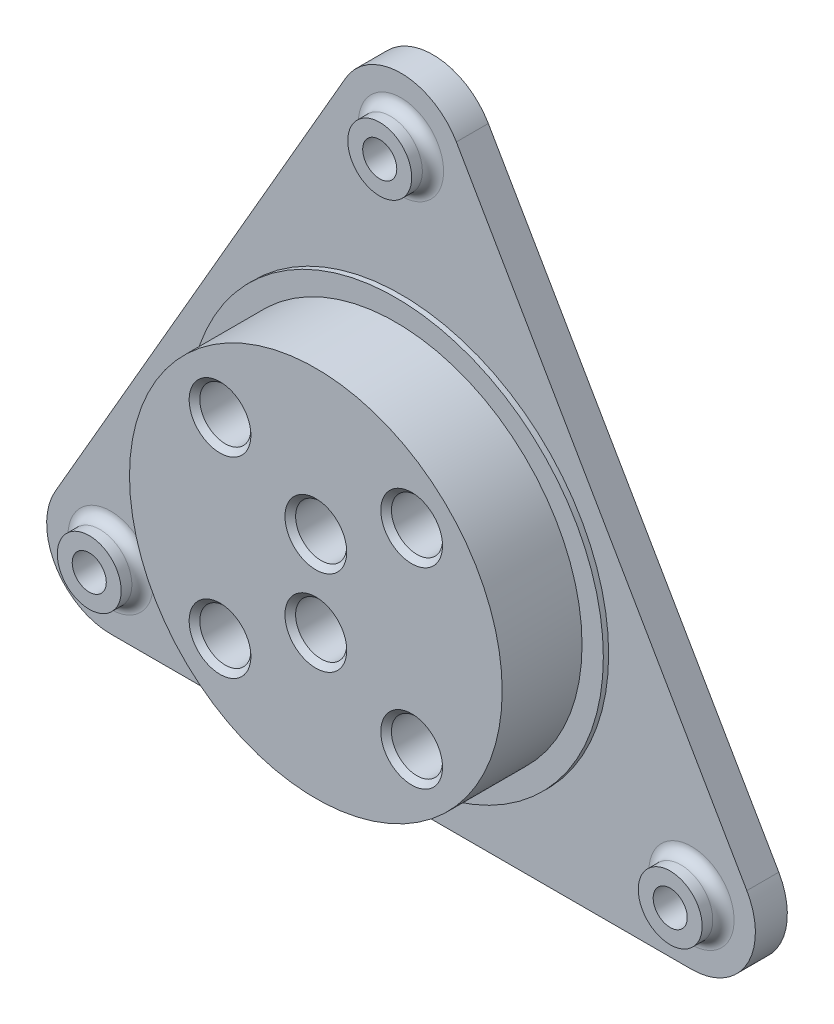
ISO-10303-21;
HEADER;
FILE_DESCRIPTION(('STEP AP214'),'2;1');
FILE_NAME('part.step','',(''),(''),'','','');
FILE_SCHEMA(('AUTOMOTIVE_DESIGN { 1 0 10303 214 1 1 1 1 }'));
ENDSEC;
DATA;
#1=APPLICATION_CONTEXT('core data for automotive mechanical design processes');
#2=APPLICATION_PROTOCOL_DEFINITION('international standard','automotive_design',2000,#1);
#3=PRODUCT_CONTEXT('',#1,'mechanical');
#4=PRODUCT('Part','Part','',(#3));
#5=PRODUCT_RELATED_PRODUCT_CATEGORY('part','',(#4));
#6=PRODUCT_DEFINITION_FORMATION('','',#4);
#7=PRODUCT_DEFINITION_CONTEXT('part definition',#1,'design');
#8=PRODUCT_DEFINITION('design','',#6,#7);
#9=PRODUCT_DEFINITION_SHAPE('','',#8);
#10=(LENGTH_UNIT() NAMED_UNIT(*) SI_UNIT(.MILLI.,.METRE.));
#11=(NAMED_UNIT(*) PLANE_ANGLE_UNIT() SI_UNIT($,.RADIAN.));
#12=(NAMED_UNIT(*) SI_UNIT($,.STERADIAN.) SOLID_ANGLE_UNIT());
#13=UNCERTAINTY_MEASURE_WITH_UNIT(LENGTH_MEASURE(1.E-05),#10,'distance_accuracy_value','');
#14=(GEOMETRIC_REPRESENTATION_CONTEXT(3) GLOBAL_UNCERTAINTY_ASSIGNED_CONTEXT((#13)) GLOBAL_UNIT_ASSIGNED_CONTEXT((#10,
#11,#12)) REPRESENTATION_CONTEXT('',''));
#15=CARTESIAN_POINT('',(0.,0.,0.));
#16=DIRECTION('',(0.,0.,1.));
#17=DIRECTION('',(1.,0.,0.));
#18=AXIS2_PLACEMENT_3D('',#15,#16,#17);
#19=CARTESIAN_POINT('',(0.,45.,3.));
#20=DIRECTION('',(0.,0.,-1.));
#21=DIRECTION('',(-1.,0.,0.));
#22=AXIS2_PLACEMENT_3D('',#19,#20,#21);
#23=PLANE('',#22);
#24=CARTESIAN_POINT('',(-27.2798002192098,-15.75,3.));
#25=DIRECTION('',(0.,0.,-1.));
#26=DIRECTION('',(-1.,0.,0.));
#27=AXIS2_PLACEMENT_3D('',#24,#25,#26);
#28=CIRCLE('',#27,4.);
#29=CARTESIAN_POINT('',(-31.2798002192098,-15.75,3.));
#30=VERTEX_POINT('',#29);
#31=EDGE_CURVE('E241',#30,#30,#28,.T.);
#32=ORIENTED_EDGE('',*,*,#31,.T.);
#33=EDGE_LOOP('',(#32));
#34=FACE_BOUND('',#33,.T.);
#35=CARTESIAN_POINT('',(27.2798002192098,-15.75,3.));
#36=DIRECTION('',(0.,0.,-1.));
#37=DIRECTION('',(-1.,0.,0.));
#38=AXIS2_PLACEMENT_3D('',#35,#36,#37);
#39=CIRCLE('',#38,4.00000000000001);
#40=CARTESIAN_POINT('',(23.2798002192098,-15.75,3.));
#41=VERTEX_POINT('',#40);
#42=EDGE_CURVE('E238',#41,#41,#39,.T.);
#43=ORIENTED_EDGE('',*,*,#42,.T.);
#44=EDGE_LOOP('',(#43));
#45=FACE_BOUND('',#44,.T.);
#46=CARTESIAN_POINT('',(0.,31.5,3.));
#47=DIRECTION('',(0.,0.,-1.));
#48=DIRECTION('',(-1.,0.,0.));
#49=AXIS2_PLACEMENT_3D('',#46,#47,#48);
#50=CIRCLE('',#49,4.);
#51=CARTESIAN_POINT('',(-4.,31.5,3.));
#52=VERTEX_POINT('',#51);
#53=EDGE_CURVE('E235',#52,#52,#50,.T.);
#54=ORIENTED_EDGE('',*,*,#53,.T.);
#55=EDGE_LOOP('',(#54));
#56=FACE_BOUND('',#55,.T.);
#57=CARTESIAN_POINT('',(0.,0.,3.));
#58=DIRECTION('',(0.,0.,1.));
#59=DIRECTION('',(1.,0.,0.));
#60=AXIS2_PLACEMENT_3D('',#57,#58,#59);
#61=CIRCLE('',#60,19.5);
#62=CARTESIAN_POINT('',(19.5,0.,3.));
#63=VERTEX_POINT('',#62);
#64=EDGE_CURVE('E190',#63,#63,#61,.T.);
#65=ORIENTED_EDGE('',*,*,#64,.F.);
#66=EDGE_LOOP('',(#65));
#67=FACE_BOUND('',#66,.T.);
#68=DIRECTION('',(0.5,-0.866025403784439,0.));
#69=VECTOR('',#68,1.);
#70=CARTESIAN_POINT('',(5.19615242270664,34.5,3.));
#71=LINE('',#70,#69);
#72=CARTESIAN_POINT('',(5.19615242270664,34.5,3.));
#73=VERTEX_POINT('',#72);
#74=CARTESIAN_POINT('',(32.4759526419165,-12.75,3.));
#75=VERTEX_POINT('',#74);
#76=EDGE_CURVE('E140',#73,#75,#71,.T.);
#77=ORIENTED_EDGE('',*,*,#76,.F.);
#78=CARTESIAN_POINT('',(0.,31.5,3.));
#79=DIRECTION('',(0.,0.,-1.));
#80=DIRECTION('',(-1.,0.,0.));
#81=AXIS2_PLACEMENT_3D('',#78,#79,#80);
#82=CIRCLE('',#81,6.00000000000001);
#83=CARTESIAN_POINT('',(-5.19615242270664,34.5,3.));
#84=VERTEX_POINT('',#83);
#85=EDGE_CURVE('E102',#84,#73,#82,.T.);
#86=ORIENTED_EDGE('',*,*,#85,.F.);
#87=DIRECTION('',(0.5,0.866025403784438,0.));
#88=VECTOR('',#87,1.);
#89=CARTESIAN_POINT('',(-5.19615242270664,34.5,3.));
#90=LINE('',#89,#88);
#91=CARTESIAN_POINT('',(-32.4759526419165,-12.75,3.));
#92=VERTEX_POINT('',#91);
#93=EDGE_CURVE('E123',#92,#84,#90,.T.);
#94=ORIENTED_EDGE('',*,*,#93,.F.);
#95=CARTESIAN_POINT('',(-27.2798002192098,-15.75,3.));
#96=DIRECTION('',(0.,0.,-1.));
#97=DIRECTION('',(-1.,0.,0.));
#98=AXIS2_PLACEMENT_3D('',#95,#96,#97);
#99=CIRCLE('',#98,6.00000000000001);
#100=CARTESIAN_POINT('',(-27.2798002192098,-21.75,3.));
#101=VERTEX_POINT('',#100);
#102=EDGE_CURVE('E62',#101,#92,#99,.T.);
#103=ORIENTED_EDGE('',*,*,#102,.F.);
#104=DIRECTION('',(-1.,0.,0.));
#105=VECTOR('',#104,1.);
#106=CARTESIAN_POINT('',(27.2798002192098,-21.75,3.));
#107=LINE('',#106,#105);
#108=CARTESIAN_POINT('',(27.2798002192098,-21.75,3.));
#109=VERTEX_POINT('',#108);
#110=EDGE_CURVE('E146',#109,#101,#107,.T.);
#111=ORIENTED_EDGE('',*,*,#110,.F.);
#112=CARTESIAN_POINT('',(27.2798002192098,-15.75,3.));
#113=DIRECTION('',(0.,0.,-1.));
#114=DIRECTION('',(-1.,0.,0.));
#115=AXIS2_PLACEMENT_3D('',#112,#113,#114);
#116=CIRCLE('',#115,6.);
#117=EDGE_CURVE('E143',#75,#109,#116,.T.);
#118=ORIENTED_EDGE('',*,*,#117,.F.);
#119=EDGE_LOOP('',(#77,#86,#94,#103,#111,#118));
#120=FACE_BOUND('',#119,.T.);
#121=ADVANCED_FACE('F45',(#34,#45,#56,#67,#120),#23,.F.);
#122=CARTESIAN_POINT('',(0.,17.5,3.5));
#123=DIRECTION('',(0.,0.,-1.));
#124=DIRECTION('',(-1.,0.,0.));
#125=AXIS2_PLACEMENT_3D('',#122,#123,#124);
#126=PLANE('',#125);
#127=CARTESIAN_POINT('',(0.,0.,3.5));
#128=DIRECTION('',(0.,0.,1.));
#129=DIRECTION('',(1.,0.,0.));
#130=AXIS2_PLACEMENT_3D('',#127,#128,#129);
#131=CIRCLE('',#130,17.5);
#132=CARTESIAN_POINT('',(17.5,0.,3.5));
#133=VERTEX_POINT('',#132);
#134=EDGE_CURVE('E179',#133,#133,#131,.T.);
#135=ORIENTED_EDGE('',*,*,#134,.F.);
#136=EDGE_LOOP('',(#135));
#137=FACE_BOUND('',#136,.T.);
#138=CARTESIAN_POINT('',(0.,0.,3.5));
#139=DIRECTION('',(0.,0.,1.));
#140=DIRECTION('',(1.,0.,0.));
#141=AXIS2_PLACEMENT_3D('',#138,#139,#140);
#142=CIRCLE('',#141,19.5);
#143=CARTESIAN_POINT('',(19.5,0.,3.5));
#144=VERTEX_POINT('',#143);
#145=EDGE_CURVE('E193',#144,#144,#142,.T.);
#146=ORIENTED_EDGE('',*,*,#145,.T.);
#147=EDGE_LOOP('',(#146));
#148=FACE_BOUND('',#147,.T.);
#149=ADVANCED_FACE('F316',(#137,#148),#126,.F.);
#150=CARTESIAN_POINT('',(0.,0.,11.));
#151=DIRECTION('',(0.,0.,1.));
#152=DIRECTION('',(1.,0.,0.));
#153=AXIS2_PLACEMENT_3D('',#150,#151,#152);
#154=CYLINDRICAL_SURFACE('',#153,19.5);
#155=ORIENTED_EDGE('',*,*,#145,.F.);
#156=EDGE_LOOP('',(#155));
#157=FACE_BOUND('',#156,.T.);
#158=ORIENTED_EDGE('',*,*,#64,.T.);
#159=EDGE_LOOP('',(#158));
#160=FACE_BOUND('',#159,.T.);
#161=ADVANCED_FACE('F324',(#157,#160),#154,.T.);
#162=CARTESIAN_POINT('',(0.,0.,0.));
#163=DIRECTION('',(0.,0.,1.));
#164=DIRECTION('',(1.,0.,0.));
#165=AXIS2_PLACEMENT_3D('',#162,#163,#164);
#166=PLANE('',#165);
#167=DIRECTION('',(0.5,0.866025403784438,0.));
#168=VECTOR('',#167,1.);
#169=CARTESIAN_POINT('',(-5.19615242270664,34.5,0.));
#170=LINE('',#169,#168);
#171=CARTESIAN_POINT('',(-32.4759526419165,-12.75,0.));
#172=VERTEX_POINT('',#171);
#173=CARTESIAN_POINT('',(-5.19615242270664,34.5,0.));
#174=VERTEX_POINT('',#173);
#175=EDGE_CURVE('E122',#172,#174,#170,.T.);
#176=ORIENTED_EDGE('',*,*,#175,.T.);
#177=CARTESIAN_POINT('',(0.,31.5,0.));
#178=DIRECTION('',(0.,0.,-1.));
#179=DIRECTION('',(-1.,0.,0.));
#180=AXIS2_PLACEMENT_3D('',#177,#178,#179);
#181=CIRCLE('',#180,6.00000000000001);
#182=CARTESIAN_POINT('',(5.19615242270664,34.5,0.));
#183=VERTEX_POINT('',#182);
#184=EDGE_CURVE('E70',#174,#183,#181,.T.);
#185=ORIENTED_EDGE('',*,*,#184,.T.);
#186=DIRECTION('',(0.5,-0.866025403784439,0.));
#187=VECTOR('',#186,1.);
#188=CARTESIAN_POINT('',(5.19615242270664,34.5,0.));
#189=LINE('',#188,#187);
#190=CARTESIAN_POINT('',(32.4759526419165,-12.75,0.));
#191=VERTEX_POINT('',#190);
#192=EDGE_CURVE('E110',#183,#191,#189,.T.);
#193=ORIENTED_EDGE('',*,*,#192,.T.);
#194=CARTESIAN_POINT('',(27.2798002192098,-15.75,0.));
#195=DIRECTION('',(0.,0.,-1.));
#196=DIRECTION('',(-1.,0.,0.));
#197=AXIS2_PLACEMENT_3D('',#194,#195,#196);
#198=CIRCLE('',#197,6.);
#199=CARTESIAN_POINT('',(27.2798002192098,-21.75,0.));
#200=VERTEX_POINT('',#199);
#201=EDGE_CURVE('E115',#191,#200,#198,.T.);
#202=ORIENTED_EDGE('',*,*,#201,.T.);
#203=DIRECTION('',(-1.,0.,0.));
#204=VECTOR('',#203,1.);
#205=CARTESIAN_POINT('',(27.2798002192098,-21.75,0.));
#206=LINE('',#205,#204);
#207=CARTESIAN_POINT('',(-27.2798002192098,-21.75,0.));
#208=VERTEX_POINT('',#207);
#209=EDGE_CURVE('E132',#200,#208,#206,.T.);
#210=ORIENTED_EDGE('',*,*,#209,.T.);
#211=CARTESIAN_POINT('',(-27.2798002192098,-15.75,0.));
#212=DIRECTION('',(0.,0.,-1.));
#213=DIRECTION('',(-1.,0.,0.));
#214=AXIS2_PLACEMENT_3D('',#211,#212,#213);
#215=CIRCLE('',#214,6.00000000000001);
#216=EDGE_CURVE('E135',#208,#172,#215,.T.);
#217=ORIENTED_EDGE('',*,*,#216,.T.);
#218=EDGE_LOOP('',(#176,#185,#193,#202,#210,#217));
#219=FACE_BOUND('',#218,.T.);
#220=CARTESIAN_POINT('',(0.,31.5,0.));
#221=DIRECTION('',(0.,0.,-1.));
#222=DIRECTION('',(0.,1.,0.));
#223=AXIS2_PLACEMENT_3D('',#220,#221,#222);
#224=CIRCLE('',#223,1.6);
#225=CARTESIAN_POINT('',(0.,33.1,0.));
#226=VERTEX_POINT('',#225);
#227=EDGE_CURVE('E176',#226,#226,#224,.T.);
#228=ORIENTED_EDGE('',*,*,#227,.F.);
#229=EDGE_LOOP('',(#228));
#230=FACE_BOUND('',#229,.T.);
#231=CARTESIAN_POINT('',(-27.2798002192098,-15.75,0.));
#232=DIRECTION('',(0.,0.,-1.));
#233=DIRECTION('',(0.,1.,0.));
#234=AXIS2_PLACEMENT_3D('',#231,#232,#233);
#235=CIRCLE('',#234,1.6);
#236=CARTESIAN_POINT('',(-27.2798002192098,-14.15,0.));
#237=VERTEX_POINT('',#236);
#238=EDGE_CURVE('E180',#237,#237,#235,.T.);
#239=ORIENTED_EDGE('',*,*,#238,.F.);
#240=EDGE_LOOP('',(#239));
#241=FACE_BOUND('',#240,.T.);
#242=CARTESIAN_POINT('',(27.2798002192098,-15.75,0.));
#243=DIRECTION('',(0.,0.,-1.));
#244=DIRECTION('',(0.,1.,0.));
#245=AXIS2_PLACEMENT_3D('',#242,#243,#244);
#246=CIRCLE('',#245,1.6);
#247=CARTESIAN_POINT('',(27.2798002192098,-14.15,0.));
#248=VERTEX_POINT('',#247);
#249=EDGE_CURVE('E175',#248,#248,#246,.T.);
#250=ORIENTED_EDGE('',*,*,#249,.F.);
#251=EDGE_LOOP('',(#250));
#252=FACE_BOUND('',#251,.T.);
#253=ADVANCED_FACE('F118',(#219,#230,#241,#252),#166,.F.);
#254=CARTESIAN_POINT('',(0.,17.5,11.));
#255=DIRECTION('',(0.,0.,-1.));
#256=DIRECTION('',(-1.,0.,0.));
#257=AXIS2_PLACEMENT_3D('',#254,#255,#256);
#258=PLANE('',#257);
#259=CARTESIAN_POINT('',(-9.,-9.,11.));
#260=DIRECTION('',(0.,0.,-1.));
#261=DIRECTION('',(-1.,0.,0.));
#262=AXIS2_PLACEMENT_3D('',#259,#260,#261);
#263=CIRCLE('',#262,2.9);
#264=CARTESIAN_POINT('',(-11.9,-9.,11.));
#265=VERTEX_POINT('',#264);
#266=EDGE_CURVE('E214',#265,#265,#263,.T.);
#267=ORIENTED_EDGE('',*,*,#266,.T.);
#268=EDGE_LOOP('',(#267));
#269=FACE_BOUND('',#268,.T.);
#270=CARTESIAN_POINT('',(9.,-9.,11.));
#271=DIRECTION('',(0.,0.,-1.));
#272=DIRECTION('',(-1.,0.,0.));
#273=AXIS2_PLACEMENT_3D('',#270,#271,#272);
#274=CIRCLE('',#273,2.9);
#275=CARTESIAN_POINT('',(6.1,-9.,11.));
#276=VERTEX_POINT('',#275);
#277=EDGE_CURVE('E211',#276,#276,#274,.T.);
#278=ORIENTED_EDGE('',*,*,#277,.T.);
#279=EDGE_LOOP('',(#278));
#280=FACE_BOUND('',#279,.T.);
#281=CARTESIAN_POINT('',(9.,9.,11.));
#282=DIRECTION('',(0.,0.,-1.));
#283=DIRECTION('',(-1.,0.,0.));
#284=AXIS2_PLACEMENT_3D('',#281,#282,#283);
#285=CIRCLE('',#284,2.9);
#286=CARTESIAN_POINT('',(6.1,9.,11.));
#287=VERTEX_POINT('',#286);
#288=EDGE_CURVE('E208',#287,#287,#285,.T.);
#289=ORIENTED_EDGE('',*,*,#288,.T.);
#290=EDGE_LOOP('',(#289));
#291=FACE_BOUND('',#290,.T.);
#292=CARTESIAN_POINT('',(-9.,9.,11.));
#293=DIRECTION('',(0.,0.,-1.));
#294=DIRECTION('',(-1.,0.,0.));
#295=AXIS2_PLACEMENT_3D('',#292,#293,#294);
#296=CIRCLE('',#295,2.9);
#297=CARTESIAN_POINT('',(-11.9,9.,11.));
#298=VERTEX_POINT('',#297);
#299=EDGE_CURVE('E205',#298,#298,#296,.T.);
#300=ORIENTED_EDGE('',*,*,#299,.T.);
#301=EDGE_LOOP('',(#300));
#302=FACE_BOUND('',#301,.T.);
#303=CARTESIAN_POINT('',(0.,-4.,11.));
#304=DIRECTION('',(0.,0.,-1.));
#305=DIRECTION('',(-1.,0.,0.));
#306=AXIS2_PLACEMENT_3D('',#303,#304,#305);
#307=CIRCLE('',#306,2.9);
#308=CARTESIAN_POINT('',(-2.9,-4.,11.));
#309=VERTEX_POINT('',#308);
#310=EDGE_CURVE('E202',#309,#309,#307,.T.);
#311=ORIENTED_EDGE('',*,*,#310,.T.);
#312=EDGE_LOOP('',(#311));
#313=FACE_BOUND('',#312,.T.);
#314=CARTESIAN_POINT('',(0.,4.,11.));
#315=DIRECTION('',(0.,0.,-1.));
#316=DIRECTION('',(-1.,0.,0.));
#317=AXIS2_PLACEMENT_3D('',#314,#315,#316);
#318=CIRCLE('',#317,2.9);
#319=CARTESIAN_POINT('',(-2.9,4.,11.));
#320=VERTEX_POINT('',#319);
#321=EDGE_CURVE('E199',#320,#320,#318,.T.);
#322=ORIENTED_EDGE('',*,*,#321,.T.);
#323=EDGE_LOOP('',(#322));
#324=FACE_BOUND('',#323,.T.);
#325=CARTESIAN_POINT('',(0.,0.,11.));
#326=DIRECTION('',(0.,0.,1.));
#327=DIRECTION('',(1.,0.,0.));
#328=AXIS2_PLACEMENT_3D('',#325,#326,#327);
#329=CIRCLE('',#328,17.5);
#330=CARTESIAN_POINT('',(17.5,0.,11.));
#331=VERTEX_POINT('',#330);
#332=EDGE_CURVE('E187',#331,#331,#329,.T.);
#333=ORIENTED_EDGE('',*,*,#332,.T.);
#334=EDGE_LOOP('',(#333));
#335=FACE_BOUND('',#334,.T.);
#336=ADVANCED_FACE('F482',(#269,#280,#291,#302,#313,#324,#335),#258,.F.);
#337=CARTESIAN_POINT('',(0.,0.,11.));
#338=DIRECTION('',(0.,0.,1.));
#339=DIRECTION('',(1.,0.,0.));
#340=AXIS2_PLACEMENT_3D('',#337,#338,#339);
#341=CYLINDRICAL_SURFACE('',#340,17.5);
#342=ORIENTED_EDGE('',*,*,#332,.F.);
#343=EDGE_LOOP('',(#342));
#344=FACE_BOUND('',#343,.T.);
#345=ORIENTED_EDGE('',*,*,#134,.T.);
#346=EDGE_LOOP('',(#345));
#347=FACE_BOUND('',#346,.T.);
#348=ADVANCED_FACE('F479',(#344,#347),#341,.T.);
#349=CARTESIAN_POINT('',(27.2798002192098,-15.75,11.));
#350=DIRECTION('',(0.,0.,-1.));
#351=DIRECTION('',(0.,1.,0.));
#352=AXIS2_PLACEMENT_3D('',#349,#350,#351);
#353=CYLINDRICAL_SURFACE('',#352,1.6);
#354=ORIENTED_EDGE('',*,*,#249,.T.);
#355=EDGE_LOOP('',(#354));
#356=FACE_BOUND('',#355,.T.);
#357=CARTESIAN_POINT('',(27.2798002192098,-15.75,5.));
#358=DIRECTION('',(0.,0.,1.));
#359=DIRECTION('',(1.,0.,0.));
#360=AXIS2_PLACEMENT_3D('',#357,#358,#359);
#361=CIRCLE('',#360,1.6);
#362=CARTESIAN_POINT('',(28.8798002192098,-15.75,5.));
#363=VERTEX_POINT('',#362);
#364=EDGE_CURVE('E128',#363,#363,#361,.T.);
#365=ORIENTED_EDGE('',*,*,#364,.T.);
#366=EDGE_LOOP('',(#365));
#367=FACE_BOUND('',#366,.T.);
#368=ADVANCED_FACE('F475',(#356,#367),#353,.F.);
#369=CARTESIAN_POINT('',(-27.2798002192098,-15.75,11.));
#370=DIRECTION('',(0.,0.,-1.));
#371=DIRECTION('',(0.,1.,0.));
#372=AXIS2_PLACEMENT_3D('',#369,#370,#371);
#373=CYLINDRICAL_SURFACE('',#372,1.6);
#374=ORIENTED_EDGE('',*,*,#238,.T.);
#375=EDGE_LOOP('',(#374));
#376=FACE_BOUND('',#375,.T.);
#377=CARTESIAN_POINT('',(-27.2798002192098,-15.75,5.));
#378=DIRECTION('',(0.,0.,1.));
#379=DIRECTION('',(1.,0.,0.));
#380=AXIS2_PLACEMENT_3D('',#377,#378,#379);
#381=CIRCLE('',#380,1.6);
#382=CARTESIAN_POINT('',(-25.6798002192098,-15.75,5.));
#383=VERTEX_POINT('',#382);
#384=EDGE_CURVE('E272',#383,#383,#381,.T.);
#385=ORIENTED_EDGE('',*,*,#384,.T.);
#386=EDGE_LOOP('',(#385));
#387=FACE_BOUND('',#386,.T.);
#388=ADVANCED_FACE('F471',(#376,#387),#373,.F.);
#389=CARTESIAN_POINT('',(0.,31.5,11.));
#390=DIRECTION('',(0.,0.,-1.));
#391=DIRECTION('',(0.,1.,0.));
#392=AXIS2_PLACEMENT_3D('',#389,#390,#391);
#393=CYLINDRICAL_SURFACE('',#392,1.6);
#394=ORIENTED_EDGE('',*,*,#227,.T.);
#395=EDGE_LOOP('',(#394));
#396=FACE_BOUND('',#395,.T.);
#397=CARTESIAN_POINT('',(0.,31.5,5.));
#398=DIRECTION('',(0.,0.,1.));
#399=DIRECTION('',(1.,0.,0.));
#400=AXIS2_PLACEMENT_3D('',#397,#398,#399);
#401=CIRCLE('',#400,1.6);
#402=CARTESIAN_POINT('',(1.6,31.5,5.));
#403=VERTEX_POINT('',#402);
#404=EDGE_CURVE('E275',#403,#403,#401,.T.);
#405=ORIENTED_EDGE('',*,*,#404,.T.);
#406=EDGE_LOOP('',(#405));
#407=FACE_BOUND('',#406,.T.);
#408=ADVANCED_FACE('F467',(#396,#407),#393,.F.);
#409=CARTESIAN_POINT('',(0.,4.,7.));
#410=DIRECTION('',(0.,0.,1.));
#411=DIRECTION('',(1.,0.,0.));
#412=AXIS2_PLACEMENT_3D('',#409,#410,#411);
#413=CYLINDRICAL_SURFACE('',#412,2.4);
#414=CARTESIAN_POINT('',(0.,4.,10.5));
#415=DIRECTION('',(0.,0.,-1.));
#416=DIRECTION('',(-1.,0.,0.));
#417=AXIS2_PLACEMENT_3D('',#414,#415,#416);
#418=CIRCLE('',#417,2.4);
#419=CARTESIAN_POINT('',(-2.4,4.,10.5));
#420=VERTEX_POINT('',#419);
#421=EDGE_CURVE('E229',#420,#420,#418,.F.);
#422=ORIENTED_EDGE('',*,*,#421,.T.);
#423=EDGE_LOOP('',(#422));
#424=FACE_BOUND('',#423,.T.);
#425=CARTESIAN_POINT('',(0.,4.,7.));
#426=DIRECTION('',(0.,0.,1.));
#427=DIRECTION('',(1.,0.,0.));
#428=AXIS2_PLACEMENT_3D('',#425,#426,#427);
#429=CIRCLE('',#428,2.4);
#430=CARTESIAN_POINT('',(2.4,4.,7.));
#431=VERTEX_POINT('',#430);
#432=EDGE_CURVE('E164',#431,#431,#429,.T.);
#433=ORIENTED_EDGE('',*,*,#432,.F.);
#434=EDGE_LOOP('',(#433));
#435=FACE_BOUND('',#434,.T.);
#436=ADVANCED_FACE('F463',(#424,#435),#413,.F.);
#437=CARTESIAN_POINT('',(0.,4.,7.));
#438=DIRECTION('',(0.,0.,1.));
#439=DIRECTION('',(1.,0.,0.));
#440=AXIS2_PLACEMENT_3D('',#437,#438,#439);
#441=PLANE('',#440);
#442=CARTESIAN_POINT('',(0.,4.,7.));
#443=DIRECTION('',(0.,0.,1.));
#444=DIRECTION('',(1.,0.,0.));
#445=AXIS2_PLACEMENT_3D('',#442,#443,#444);
#446=CIRCLE('',#445,1.75);
#447=CARTESIAN_POINT('',(1.75,4.,7.));
#448=VERTEX_POINT('',#447);
#449=EDGE_CURVE('E49',#448,#448,#446,.T.);
#450=ORIENTED_EDGE('',*,*,#449,.F.);
#451=EDGE_LOOP('',(#450));
#452=FACE_BOUND('',#451,.T.);
#453=ORIENTED_EDGE('',*,*,#432,.T.);
#454=EDGE_LOOP('',(#453));
#455=FACE_BOUND('',#454,.T.);
#456=ADVANCED_FACE('F426',(#452,#455),#441,.T.);
#457=CARTESIAN_POINT('',(-9.,-9.,7.));
#458=DIRECTION('',(0.,0.,1.));
#459=DIRECTION('',(1.,0.,0.));
#460=AXIS2_PLACEMENT_3D('',#457,#458,#459);
#461=CYLINDRICAL_SURFACE('',#460,2.4);
#462=CARTESIAN_POINT('',(-9.,-9.,10.5));
#463=DIRECTION('',(0.,0.,-1.));
#464=DIRECTION('',(-1.,0.,0.));
#465=AXIS2_PLACEMENT_3D('',#462,#463,#464);
#466=CIRCLE('',#465,2.4);
#467=CARTESIAN_POINT('',(-11.4,-9.,10.5));
#468=VERTEX_POINT('',#467);
#469=EDGE_CURVE('E196',#468,#468,#466,.F.);
#470=ORIENTED_EDGE('',*,*,#469,.T.);
#471=EDGE_LOOP('',(#470));
#472=FACE_BOUND('',#471,.T.);
#473=CARTESIAN_POINT('',(-9.,-9.,7.));
#474=DIRECTION('',(0.,0.,1.));
#475=DIRECTION('',(1.,0.,0.));
#476=AXIS2_PLACEMENT_3D('',#473,#474,#475);
#477=CIRCLE('',#476,2.4);
#478=CARTESIAN_POINT('',(-6.6,-9.,7.));
#479=VERTEX_POINT('',#478);
#480=EDGE_CURVE('E106',#479,#479,#477,.T.);
#481=ORIENTED_EDGE('',*,*,#480,.F.);
#482=EDGE_LOOP('',(#481));
#483=FACE_BOUND('',#482,.T.);
#484=ADVANCED_FACE('F422',(#472,#483),#461,.F.);
#485=CARTESIAN_POINT('',(-9.,-9.,7.));
#486=DIRECTION('',(0.,0.,1.));
#487=DIRECTION('',(1.,0.,0.));
#488=AXIS2_PLACEMENT_3D('',#485,#486,#487);
#489=PLANE('',#488);
#490=CARTESIAN_POINT('',(-9.,-9.,7.));
#491=DIRECTION('',(0.,0.,1.));
#492=DIRECTION('',(1.,0.,0.));
#493=AXIS2_PLACEMENT_3D('',#490,#491,#492);
#494=CIRCLE('',#493,1.75);
#495=CARTESIAN_POINT('',(-7.25,-9.,7.));
#496=VERTEX_POINT('',#495);
#497=EDGE_CURVE('E258',#496,#496,#494,.T.);
#498=ORIENTED_EDGE('',*,*,#497,.F.);
#499=EDGE_LOOP('',(#498));
#500=FACE_BOUND('',#499,.T.);
#501=ORIENTED_EDGE('',*,*,#480,.T.);
#502=EDGE_LOOP('',(#501));
#503=FACE_BOUND('',#502,.T.);
#504=ADVANCED_FACE('F425',(#500,#503),#489,.T.);
#505=CARTESIAN_POINT('',(9.,-9.,7.));
#506=DIRECTION('',(0.,0.,1.));
#507=DIRECTION('',(1.,0.,0.));
#508=AXIS2_PLACEMENT_3D('',#505,#506,#507);
#509=CYLINDRICAL_SURFACE('',#508,2.4);
#510=CARTESIAN_POINT('',(9.,-9.,10.5));
#511=DIRECTION('',(0.,0.,-1.));
#512=DIRECTION('',(-1.,0.,0.));
#513=AXIS2_PLACEMENT_3D('',#510,#511,#512);
#514=CIRCLE('',#513,2.4);
#515=CARTESIAN_POINT('',(6.6,-9.,10.5));
#516=VERTEX_POINT('',#515);
#517=EDGE_CURVE('E217',#516,#516,#514,.F.);
#518=ORIENTED_EDGE('',*,*,#517,.T.);
#519=EDGE_LOOP('',(#518));
#520=FACE_BOUND('',#519,.T.);
#521=CARTESIAN_POINT('',(9.,-9.,7.));
#522=DIRECTION('',(0.,0.,1.));
#523=DIRECTION('',(1.,0.,0.));
#524=AXIS2_PLACEMENT_3D('',#521,#522,#523);
#525=CIRCLE('',#524,2.4);
#526=CARTESIAN_POINT('',(11.4,-9.,7.));
#527=VERTEX_POINT('',#526);
#528=EDGE_CURVE('E160',#527,#527,#525,.T.);
#529=ORIENTED_EDGE('',*,*,#528,.F.);
#530=EDGE_LOOP('',(#529));
#531=FACE_BOUND('',#530,.T.);
#532=ADVANCED_FACE('F430',(#520,#531),#509,.F.);
#533=CARTESIAN_POINT('',(9.,-9.,7.));
#534=DIRECTION('',(0.,0.,1.));
#535=DIRECTION('',(1.,0.,0.));
#536=AXIS2_PLACEMENT_3D('',#533,#534,#535);
#537=PLANE('',#536);
#538=CARTESIAN_POINT('',(9.,-9.,7.));
#539=DIRECTION('',(0.,0.,1.));
#540=DIRECTION('',(1.,0.,0.));
#541=AXIS2_PLACEMENT_3D('',#538,#539,#540);
#542=CIRCLE('',#541,1.75);
#543=CARTESIAN_POINT('',(10.75,-9.,7.));
#544=VERTEX_POINT('',#543);
#545=EDGE_CURVE('E256',#544,#544,#542,.T.);
#546=ORIENTED_EDGE('',*,*,#545,.F.);
#547=EDGE_LOOP('',(#546));
#548=FACE_BOUND('',#547,.T.);
#549=ORIENTED_EDGE('',*,*,#528,.T.);
#550=EDGE_LOOP('',(#549));
#551=FACE_BOUND('',#550,.T.);
#552=ADVANCED_FACE('F450',(#548,#551),#537,.T.);
#553=CARTESIAN_POINT('',(9.,9.,7.));
#554=DIRECTION('',(0.,0.,1.));
#555=DIRECTION('',(1.,0.,0.));
#556=AXIS2_PLACEMENT_3D('',#553,#554,#555);
#557=CYLINDRICAL_SURFACE('',#556,2.4);
#558=CARTESIAN_POINT('',(9.,9.,10.5));
#559=DIRECTION('',(0.,0.,-1.));
#560=DIRECTION('',(-1.,0.,0.));
#561=AXIS2_PLACEMENT_3D('',#558,#559,#560);
#562=CIRCLE('',#561,2.4);
#563=CARTESIAN_POINT('',(6.6,9.,10.5));
#564=VERTEX_POINT('',#563);
#565=EDGE_CURVE('E220',#564,#564,#562,.F.);
#566=ORIENTED_EDGE('',*,*,#565,.T.);
#567=EDGE_LOOP('',(#566));
#568=FACE_BOUND('',#567,.T.);
#569=CARTESIAN_POINT('',(9.,9.,7.));
#570=DIRECTION('',(0.,0.,1.));
#571=DIRECTION('',(1.,0.,0.));
#572=AXIS2_PLACEMENT_3D('',#569,#570,#571);
#573=CIRCLE('',#572,2.4);
#574=CARTESIAN_POINT('',(11.4,9.,7.));
#575=VERTEX_POINT('',#574);
#576=EDGE_CURVE('E168',#575,#575,#573,.T.);
#577=ORIENTED_EDGE('',*,*,#576,.F.);
#578=EDGE_LOOP('',(#577));
#579=FACE_BOUND('',#578,.T.);
#580=ADVANCED_FACE('F447',(#568,#579),#557,.F.);
#581=CARTESIAN_POINT('',(9.,9.,7.));
#582=DIRECTION('',(0.,0.,1.));
#583=DIRECTION('',(1.,0.,0.));
#584=AXIS2_PLACEMENT_3D('',#581,#582,#583);
#585=PLANE('',#584);
#586=CARTESIAN_POINT('',(9.,9.,7.));
#587=DIRECTION('',(0.,0.,1.));
#588=DIRECTION('',(1.,0.,0.));
#589=AXIS2_PLACEMENT_3D('',#586,#587,#588);
#590=CIRCLE('',#589,1.75);
#591=CARTESIAN_POINT('',(10.75,9.,7.));
#592=VERTEX_POINT('',#591);
#593=EDGE_CURVE('E253',#592,#592,#590,.T.);
#594=ORIENTED_EDGE('',*,*,#593,.F.);
#595=EDGE_LOOP('',(#594));
#596=FACE_BOUND('',#595,.T.);
#597=ORIENTED_EDGE('',*,*,#576,.T.);
#598=EDGE_LOOP('',(#597));
#599=FACE_BOUND('',#598,.T.);
#600=ADVANCED_FACE('F442',(#596,#599),#585,.T.);
#601=CARTESIAN_POINT('',(-9.,9.,7.));
#602=DIRECTION('',(0.,0.,1.));
#603=DIRECTION('',(1.,0.,0.));
#604=AXIS2_PLACEMENT_3D('',#601,#602,#603);
#605=CYLINDRICAL_SURFACE('',#604,2.4);
#606=CARTESIAN_POINT('',(-9.,9.,10.5));
#607=DIRECTION('',(0.,0.,-1.));
#608=DIRECTION('',(-1.,0.,0.));
#609=AXIS2_PLACEMENT_3D('',#606,#607,#608);
#610=CIRCLE('',#609,2.4);
#611=CARTESIAN_POINT('',(-11.4,9.,10.5));
#612=VERTEX_POINT('',#611);
#613=EDGE_CURVE('E223',#612,#612,#610,.F.);
#614=ORIENTED_EDGE('',*,*,#613,.T.);
#615=EDGE_LOOP('',(#614));
#616=FACE_BOUND('',#615,.T.);
#617=CARTESIAN_POINT('',(-9.,9.,7.));
#618=DIRECTION('',(0.,0.,1.));
#619=DIRECTION('',(1.,0.,0.));
#620=AXIS2_PLACEMENT_3D('',#617,#618,#619);
#621=CIRCLE('',#620,2.4);
#622=CARTESIAN_POINT('',(-6.6,9.,7.));
#623=VERTEX_POINT('',#622);
#624=EDGE_CURVE('E165',#623,#623,#621,.T.);
#625=ORIENTED_EDGE('',*,*,#624,.F.);
#626=EDGE_LOOP('',(#625));
#627=FACE_BOUND('',#626,.T.);
#628=ADVANCED_FACE('F439',(#616,#627),#605,.F.);
#629=CARTESIAN_POINT('',(-9.,9.,7.));
#630=DIRECTION('',(0.,0.,1.));
#631=DIRECTION('',(1.,0.,0.));
#632=AXIS2_PLACEMENT_3D('',#629,#630,#631);
#633=PLANE('',#632);
#634=CARTESIAN_POINT('',(-9.,9.,7.));
#635=DIRECTION('',(0.,0.,1.));
#636=DIRECTION('',(1.,0.,0.));
#637=AXIS2_PLACEMENT_3D('',#634,#635,#636);
#638=CIRCLE('',#637,1.75);
#639=CARTESIAN_POINT('',(-7.25,9.,7.));
#640=VERTEX_POINT('',#639);
#641=EDGE_CURVE('E249',#640,#640,#638,.T.);
#642=ORIENTED_EDGE('',*,*,#641,.F.);
#643=EDGE_LOOP('',(#642));
#644=FACE_BOUND('',#643,.T.);
#645=ORIENTED_EDGE('',*,*,#624,.T.);
#646=EDGE_LOOP('',(#645));
#647=FACE_BOUND('',#646,.T.);
#648=ADVANCED_FACE('F435',(#644,#647),#633,.T.);
#649=CARTESIAN_POINT('',(0.,-4.,7.));
#650=DIRECTION('',(0.,0.,1.));
#651=DIRECTION('',(1.,0.,0.));
#652=AXIS2_PLACEMENT_3D('',#649,#650,#651);
#653=CYLINDRICAL_SURFACE('',#652,2.4);
#654=CARTESIAN_POINT('',(0.,-4.,10.5));
#655=DIRECTION('',(0.,0.,-1.));
#656=DIRECTION('',(-1.,0.,0.));
#657=AXIS2_PLACEMENT_3D('',#654,#655,#656);
#658=CIRCLE('',#657,2.4);
#659=CARTESIAN_POINT('',(-2.4,-4.,10.5));
#660=VERTEX_POINT('',#659);
#661=EDGE_CURVE('E226',#660,#660,#658,.F.);
#662=ORIENTED_EDGE('',*,*,#661,.T.);
#663=EDGE_LOOP('',(#662));
#664=FACE_BOUND('',#663,.T.);
#665=CARTESIAN_POINT('',(0.,-4.,7.));
#666=DIRECTION('',(0.,0.,1.));
#667=DIRECTION('',(1.,0.,0.));
#668=AXIS2_PLACEMENT_3D('',#665,#666,#667);
#669=CIRCLE('',#668,2.4);
#670=CARTESIAN_POINT('',(2.4,-4.,7.));
#671=VERTEX_POINT('',#670);
#672=EDGE_CURVE('E161',#671,#671,#669,.T.);
#673=ORIENTED_EDGE('',*,*,#672,.F.);
#674=EDGE_LOOP('',(#673));
#675=FACE_BOUND('',#674,.T.);
#676=ADVANCED_FACE('F432',(#664,#675),#653,.F.);
#677=CARTESIAN_POINT('',(0.,-4.,7.));
#678=DIRECTION('',(0.,0.,1.));
#679=DIRECTION('',(1.,0.,0.));
#680=AXIS2_PLACEMENT_3D('',#677,#678,#679);
#681=PLANE('',#680);
#682=CARTESIAN_POINT('',(0.,-4.,7.));
#683=DIRECTION('',(0.,0.,1.));
#684=DIRECTION('',(1.,0.,0.));
#685=AXIS2_PLACEMENT_3D('',#682,#683,#684);
#686=CIRCLE('',#685,1.75);
#687=CARTESIAN_POINT('',(1.75,-4.,7.));
#688=VERTEX_POINT('',#687);
#689=EDGE_CURVE('E246',#688,#688,#686,.T.);
#690=ORIENTED_EDGE('',*,*,#689,.F.);
#691=EDGE_LOOP('',(#690));
#692=FACE_BOUND('',#691,.T.);
#693=ORIENTED_EDGE('',*,*,#672,.T.);
#694=EDGE_LOOP('',(#693));
#695=FACE_BOUND('',#694,.T.);
#696=ADVANCED_FACE('F421',(#692,#695),#681,.T.);
#697=CARTESIAN_POINT('',(0.,31.5,0.));
#698=DIRECTION('',(0.,0.,1.));
#699=DIRECTION('',(1.,0.,0.));
#700=AXIS2_PLACEMENT_3D('',#697,#698,#699);
#701=CYLINDRICAL_SURFACE('',#700,6.00000000000001);
#702=ORIENTED_EDGE('',*,*,#85,.T.);
#703=DIRECTION('',(0.,0.,1.));
#704=VECTOR('',#703,1.);
#705=CARTESIAN_POINT('',(5.19615242270664,34.5,0.));
#706=LINE('',#705,#704);
#707=EDGE_CURVE('E98',#183,#73,#706,.T.);
#708=ORIENTED_EDGE('',*,*,#707,.F.);
#709=ORIENTED_EDGE('',*,*,#184,.F.);
#710=DIRECTION('',(0.,0.,1.));
#711=VECTOR('',#710,1.);
#712=CARTESIAN_POINT('',(-5.19615242270664,34.5,0.));
#713=LINE('',#712,#711);
#714=EDGE_CURVE('E138',#174,#84,#713,.T.);
#715=ORIENTED_EDGE('',*,*,#714,.T.);
#716=EDGE_LOOP('',(#702,#708,#709,#715));
#717=FACE_BOUND('',#716,.T.);
#718=ADVANCED_FACE('F100',(#717),#701,.T.);
#719=CARTESIAN_POINT('',(5.19615242270664,34.5,0.));
#720=DIRECTION('',(-0.866025403784438,-0.5,0.));
#721=DIRECTION('',(0.5,-0.866025403784439,0.));
#722=AXIS2_PLACEMENT_3D('',#719,#720,#721);
#723=PLANE('',#722);
#724=ORIENTED_EDGE('',*,*,#76,.T.);
#725=DIRECTION('',(0.,0.,1.));
#726=VECTOR('',#725,1.);
#727=CARTESIAN_POINT('',(32.4759526419165,-12.75,0.));
#728=LINE('',#727,#726);
#729=EDGE_CURVE('E107',#191,#75,#728,.T.);
#730=ORIENTED_EDGE('',*,*,#729,.F.);
#731=ORIENTED_EDGE('',*,*,#192,.F.);
#732=ORIENTED_EDGE('',*,*,#707,.T.);
#733=EDGE_LOOP('',(#724,#730,#731,#732));
#734=FACE_BOUND('',#733,.T.);
#735=ADVANCED_FACE('F111',(#734),#723,.F.);
#736=CARTESIAN_POINT('',(27.2798002192098,-15.75,0.));
#737=DIRECTION('',(0.,0.,1.));
#738=DIRECTION('',(1.,0.,0.));
#739=AXIS2_PLACEMENT_3D('',#736,#737,#738);
#740=CYLINDRICAL_SURFACE('',#739,6.);
#741=ORIENTED_EDGE('',*,*,#117,.T.);
#742=DIRECTION('',(0.,0.,1.));
#743=VECTOR('',#742,1.);
#744=CARTESIAN_POINT('',(27.2798002192098,-21.75,0.));
#745=LINE('',#744,#743);
#746=EDGE_CURVE('E155',#200,#109,#745,.T.);
#747=ORIENTED_EDGE('',*,*,#746,.F.);
#748=ORIENTED_EDGE('',*,*,#201,.F.);
#749=ORIENTED_EDGE('',*,*,#729,.T.);
#750=EDGE_LOOP('',(#741,#747,#748,#749));
#751=FACE_BOUND('',#750,.T.);
#752=ADVANCED_FACE('F412',(#751),#740,.T.);
#753=CARTESIAN_POINT('',(27.2798002192098,-21.75,0.));
#754=DIRECTION('',(0.,1.,0.));
#755=DIRECTION('',(0.,0.,1.));
#756=AXIS2_PLACEMENT_3D('',#753,#754,#755);
#757=PLANE('',#756);
#758=ORIENTED_EDGE('',*,*,#110,.T.);
#759=DIRECTION('',(0.,0.,1.));
#760=VECTOR('',#759,1.);
#761=CARTESIAN_POINT('',(-27.2798002192098,-21.75,0.));
#762=LINE('',#761,#760);
#763=EDGE_CURVE('E153',#208,#101,#762,.T.);
#764=ORIENTED_EDGE('',*,*,#763,.F.);
#765=ORIENTED_EDGE('',*,*,#209,.F.);
#766=ORIENTED_EDGE('',*,*,#746,.T.);
#767=EDGE_LOOP('',(#758,#764,#765,#766));
#768=FACE_BOUND('',#767,.T.);
#769=ADVANCED_FACE('F409',(#768),#757,.F.);
#770=CARTESIAN_POINT('',(-27.2798002192098,-15.75,0.));
#771=DIRECTION('',(0.,0.,1.));
#772=DIRECTION('',(1.,0.,0.));
#773=AXIS2_PLACEMENT_3D('',#770,#771,#772);
#774=CYLINDRICAL_SURFACE('',#773,6.00000000000001);
#775=ORIENTED_EDGE('',*,*,#102,.T.);
#776=DIRECTION('',(0.,0.,1.));
#777=VECTOR('',#776,1.);
#778=CARTESIAN_POINT('',(-32.4759526419165,-12.75,0.));
#779=LINE('',#778,#777);
#780=EDGE_CURVE('E151',#172,#92,#779,.T.);
#781=ORIENTED_EDGE('',*,*,#780,.F.);
#782=ORIENTED_EDGE('',*,*,#216,.F.);
#783=ORIENTED_EDGE('',*,*,#763,.T.);
#784=EDGE_LOOP('',(#775,#781,#782,#783));
#785=FACE_BOUND('',#784,.T.);
#786=ADVANCED_FACE('F405',(#785),#774,.T.);
#787=CARTESIAN_POINT('',(-5.19615242270664,34.5,0.));
#788=DIRECTION('',(0.866025403784439,-0.5,0.));
#789=DIRECTION('',(0.5,0.866025403784439,0.));
#790=AXIS2_PLACEMENT_3D('',#787,#788,#789);
#791=PLANE('',#790);
#792=ORIENTED_EDGE('',*,*,#93,.T.);
#793=ORIENTED_EDGE('',*,*,#714,.F.);
#794=ORIENTED_EDGE('',*,*,#175,.F.);
#795=ORIENTED_EDGE('',*,*,#780,.T.);
#796=EDGE_LOOP('',(#792,#793,#794,#795));
#797=FACE_BOUND('',#796,.T.);
#798=ADVANCED_FACE('F342',(#797),#791,.F.);
#799=CARTESIAN_POINT('',(-9.,-9.,10.5));
#800=DIRECTION('',(0.,0.,1.));
#801=DIRECTION('',(1.,0.,0.));
#802=AXIS2_PLACEMENT_3D('',#799,#800,#801);
#803=CONICAL_SURFACE('',#802,2.4,0.78539816339744);
#804=ORIENTED_EDGE('',*,*,#266,.F.);
#805=EDGE_LOOP('',(#804));
#806=FACE_BOUND('',#805,.T.);
#807=ORIENTED_EDGE('',*,*,#469,.F.);
#808=EDGE_LOOP('',(#807));
#809=FACE_BOUND('',#808,.T.);
#810=ADVANCED_FACE('F335',(#806,#809),#803,.F.);
#811=CARTESIAN_POINT('',(9.,-9.,10.5));
#812=DIRECTION('',(0.,0.,1.));
#813=DIRECTION('',(1.,0.,0.));
#814=AXIS2_PLACEMENT_3D('',#811,#812,#813);
#815=CONICAL_SURFACE('',#814,2.4,0.78539816339744);
#816=ORIENTED_EDGE('',*,*,#277,.F.);
#817=EDGE_LOOP('',(#816));
#818=FACE_BOUND('',#817,.T.);
#819=ORIENTED_EDGE('',*,*,#517,.F.);
#820=EDGE_LOOP('',(#819));
#821=FACE_BOUND('',#820,.T.);
#822=ADVANCED_FACE('F341',(#818,#821),#815,.F.);
#823=CARTESIAN_POINT('',(9.,9.,10.5));
#824=DIRECTION('',(0.,0.,1.));
#825=DIRECTION('',(1.,0.,0.));
#826=AXIS2_PLACEMENT_3D('',#823,#824,#825);
#827=CONICAL_SURFACE('',#826,2.4,0.78539816339744);
#828=ORIENTED_EDGE('',*,*,#288,.F.);
#829=EDGE_LOOP('',(#828));
#830=FACE_BOUND('',#829,.T.);
#831=ORIENTED_EDGE('',*,*,#565,.F.);
#832=EDGE_LOOP('',(#831));
#833=FACE_BOUND('',#832,.T.);
#834=ADVANCED_FACE('F349',(#830,#833),#827,.F.);
#835=CARTESIAN_POINT('',(-9.,9.,10.5));
#836=DIRECTION('',(0.,0.,1.));
#837=DIRECTION('',(1.,0.,0.));
#838=AXIS2_PLACEMENT_3D('',#835,#836,#837);
#839=CONICAL_SURFACE('',#838,2.4,0.78539816339744);
#840=ORIENTED_EDGE('',*,*,#299,.F.);
#841=EDGE_LOOP('',(#840));
#842=FACE_BOUND('',#841,.T.);
#843=ORIENTED_EDGE('',*,*,#613,.F.);
#844=EDGE_LOOP('',(#843));
#845=FACE_BOUND('',#844,.T.);
#846=ADVANCED_FACE('F356',(#842,#845),#839,.F.);
#847=CARTESIAN_POINT('',(0.,-4.,10.5));
#848=DIRECTION('',(0.,0.,1.));
#849=DIRECTION('',(1.,0.,0.));
#850=AXIS2_PLACEMENT_3D('',#847,#848,#849);
#851=CONICAL_SURFACE('',#850,2.4,0.785398163397441);
#852=ORIENTED_EDGE('',*,*,#310,.F.);
#853=EDGE_LOOP('',(#852));
#854=FACE_BOUND('',#853,.T.);
#855=ORIENTED_EDGE('',*,*,#661,.F.);
#856=EDGE_LOOP('',(#855));
#857=FACE_BOUND('',#856,.T.);
#858=ADVANCED_FACE('F363',(#854,#857),#851,.F.);
#859=CARTESIAN_POINT('',(0.,4.,10.5));
#860=DIRECTION('',(0.,0.,1.));
#861=DIRECTION('',(1.,0.,0.));
#862=AXIS2_PLACEMENT_3D('',#859,#860,#861);
#863=CONICAL_SURFACE('',#862,2.4,0.785398163397441);
#864=ORIENTED_EDGE('',*,*,#321,.F.);
#865=EDGE_LOOP('',(#864));
#866=FACE_BOUND('',#865,.T.);
#867=ORIENTED_EDGE('',*,*,#421,.F.);
#868=EDGE_LOOP('',(#867));
#869=FACE_BOUND('',#868,.T.);
#870=ADVANCED_FACE('F370',(#866,#869),#863,.F.);
#871=CARTESIAN_POINT('',(0.,31.5,5.));
#872=DIRECTION('',(0.,0.,1.));
#873=DIRECTION('',(1.,0.,0.));
#874=AXIS2_PLACEMENT_3D('',#871,#872,#873);
#875=PLANE('',#874);
#876=CARTESIAN_POINT('',(0.,31.5,5.));
#877=DIRECTION('',(0.,0.,1.));
#878=DIRECTION('',(1.,0.,0.));
#879=AXIS2_PLACEMENT_3D('',#876,#877,#878);
#880=CIRCLE('',#879,3.);
#881=CARTESIAN_POINT('',(3.,31.5,5.));
#882=VERTEX_POINT('',#881);
#883=EDGE_CURVE('E141',#882,#882,#880,.T.);
#884=ORIENTED_EDGE('',*,*,#883,.T.);
#885=EDGE_LOOP('',(#884));
#886=FACE_BOUND('',#885,.T.);
#887=ORIENTED_EDGE('',*,*,#404,.F.);
#888=EDGE_LOOP('',(#887));
#889=FACE_BOUND('',#888,.T.);
#890=ADVANCED_FACE('F376',(#886,#889),#875,.T.);
#891=CARTESIAN_POINT('',(0.,31.5,5.));
#892=DIRECTION('',(0.,0.,-1.));
#893=DIRECTION('',(-1.,0.,0.));
#894=AXIS2_PLACEMENT_3D('',#891,#892,#893);
#895=CYLINDRICAL_SURFACE('',#894,3.);
#896=CARTESIAN_POINT('',(0.,31.5,4.));
#897=DIRECTION('',(0.,0.,-1.));
#898=DIRECTION('',(-1.,0.,0.));
#899=AXIS2_PLACEMENT_3D('',#896,#897,#898);
#900=CIRCLE('',#899,3.);
#901=CARTESIAN_POINT('',(-3.,31.5,4.));
#902=VERTEX_POINT('',#901);
#903=EDGE_CURVE('E13',#902,#902,#900,.F.);
#904=ORIENTED_EDGE('',*,*,#903,.T.);
#905=EDGE_LOOP('',(#904));
#906=FACE_BOUND('',#905,.T.);
#907=ORIENTED_EDGE('',*,*,#883,.F.);
#908=EDGE_LOOP('',(#907));
#909=FACE_BOUND('',#908,.T.);
#910=ADVANCED_FACE('F656',(#906,#909),#895,.T.);
#911=CARTESIAN_POINT('',(-27.2798002192098,-15.75,5.));
#912=DIRECTION('',(0.,0.,1.));
#913=DIRECTION('',(1.,0.,0.));
#914=AXIS2_PLACEMENT_3D('',#911,#912,#913);
#915=PLANE('',#914);
#916=CARTESIAN_POINT('',(-27.2798002192098,-15.75,5.));
#917=DIRECTION('',(0.,0.,1.));
#918=DIRECTION('',(1.,0.,0.));
#919=AXIS2_PLACEMENT_3D('',#916,#917,#918);
#920=CIRCLE('',#919,3.);
#921=CARTESIAN_POINT('',(-24.2798002192098,-15.75,5.));
#922=VERTEX_POINT('',#921);
#923=EDGE_CURVE('E270',#922,#922,#920,.T.);
#924=ORIENTED_EDGE('',*,*,#923,.T.);
#925=EDGE_LOOP('',(#924));
#926=FACE_BOUND('',#925,.T.);
#927=ORIENTED_EDGE('',*,*,#384,.F.);
#928=EDGE_LOOP('',(#927));
#929=FACE_BOUND('',#928,.T.);
#930=ADVANCED_FACE('F400',(#926,#929),#915,.T.);
#931=CARTESIAN_POINT('',(-27.2798002192098,-15.75,5.));
#932=DIRECTION('',(0.,0.,-1.));
#933=DIRECTION('',(-1.,0.,0.));
#934=AXIS2_PLACEMENT_3D('',#931,#932,#933);
#935=CYLINDRICAL_SURFACE('',#934,3.);
#936=CARTESIAN_POINT('',(-27.2798002192098,-15.75,4.));
#937=DIRECTION('',(0.,0.,-1.));
#938=DIRECTION('',(-1.,0.,0.));
#939=AXIS2_PLACEMENT_3D('',#936,#937,#938);
#940=CIRCLE('',#939,3.);
#941=CARTESIAN_POINT('',(-30.2798002192098,-15.75,4.));
#942=VERTEX_POINT('',#941);
#943=EDGE_CURVE('E232',#942,#942,#940,.F.);
#944=ORIENTED_EDGE('',*,*,#943,.T.);
#945=EDGE_LOOP('',(#944));
#946=FACE_BOUND('',#945,.T.);
#947=ORIENTED_EDGE('',*,*,#923,.F.);
#948=EDGE_LOOP('',(#947));
#949=FACE_BOUND('',#948,.T.);
#950=ADVANCED_FACE('F397',(#946,#949),#935,.T.);
#951=CARTESIAN_POINT('',(27.2798002192098,-15.75,5.));
#952=DIRECTION('',(0.,0.,1.));
#953=DIRECTION('',(1.,0.,0.));
#954=AXIS2_PLACEMENT_3D('',#951,#952,#953);
#955=PLANE('',#954);
#956=CARTESIAN_POINT('',(27.2798002192098,-15.75,5.));
#957=DIRECTION('',(0.,0.,1.));
#958=DIRECTION('',(1.,0.,0.));
#959=AXIS2_PLACEMENT_3D('',#956,#957,#958);
#960=CIRCLE('',#959,3.);
#961=CARTESIAN_POINT('',(30.2798002192098,-15.75,5.));
#962=VERTEX_POINT('',#961);
#963=EDGE_CURVE('E263',#962,#962,#960,.T.);
#964=ORIENTED_EDGE('',*,*,#963,.T.);
#965=EDGE_LOOP('',(#964));
#966=FACE_BOUND('',#965,.T.);
#967=ORIENTED_EDGE('',*,*,#364,.F.);
#968=EDGE_LOOP('',(#967));
#969=FACE_BOUND('',#968,.T.);
#970=ADVANCED_FACE('F392',(#966,#969),#955,.T.);
#971=CARTESIAN_POINT('',(27.2798002192098,-15.75,5.));
#972=DIRECTION('',(0.,0.,-1.));
#973=DIRECTION('',(-1.,0.,0.));
#974=AXIS2_PLACEMENT_3D('',#971,#972,#973);
#975=CYLINDRICAL_SURFACE('',#974,3.);
#976=CARTESIAN_POINT('',(27.2798002192098,-15.75,4.));
#977=DIRECTION('',(0.,0.,-1.));
#978=DIRECTION('',(-1.,0.,0.));
#979=AXIS2_PLACEMENT_3D('',#976,#977,#978);
#980=CIRCLE('',#979,3.);
#981=CARTESIAN_POINT('',(24.2798002192098,-15.75,4.));
#982=VERTEX_POINT('',#981);
#983=EDGE_CURVE('E54',#982,#982,#980,.F.);
#984=ORIENTED_EDGE('',*,*,#983,.T.);
#985=EDGE_LOOP('',(#984));
#986=FACE_BOUND('',#985,.T.);
#987=ORIENTED_EDGE('',*,*,#963,.F.);
#988=EDGE_LOOP('',(#987));
#989=FACE_BOUND('',#988,.T.);
#990=ADVANCED_FACE('F380',(#986,#989),#975,.T.);
#991=CARTESIAN_POINT('',(-27.2798002192098,-15.75,4.));
#992=DIRECTION('',(0.,0.,-1.));
#993=DIRECTION('',(-1.,0.,0.));
#994=AXIS2_PLACEMENT_3D('',#991,#992,#993);
#995=TOROIDAL_SURFACE('',#994,4.,1.);
#996=ORIENTED_EDGE('',*,*,#31,.F.);
#997=EDGE_LOOP('',(#996));
#998=FACE_BOUND('',#997,.T.);
#999=ORIENTED_EDGE('',*,*,#943,.F.);
#1000=EDGE_LOOP('',(#999));
#1001=FACE_BOUND('',#1000,.T.);
#1002=ADVANCED_FACE('F378',(#998,#1001),#995,.F.);
#1003=CARTESIAN_POINT('',(27.2798002192098,-15.75,4.));
#1004=DIRECTION('',(0.,0.,-1.));
#1005=DIRECTION('',(-1.,0.,0.));
#1006=AXIS2_PLACEMENT_3D('',#1003,#1004,#1005);
#1007=TOROIDAL_SURFACE('',#1006,4.00000000000001,1.);
#1008=ORIENTED_EDGE('',*,*,#42,.F.);
#1009=EDGE_LOOP('',(#1008));
#1010=FACE_BOUND('',#1009,.T.);
#1011=ORIENTED_EDGE('',*,*,#983,.F.);
#1012=EDGE_LOOP('',(#1011));
#1013=FACE_BOUND('',#1012,.T.);
#1014=ADVANCED_FACE('F313',(#1010,#1013),#1007,.F.);
#1015=CARTESIAN_POINT('',(0.,31.5,4.));
#1016=DIRECTION('',(0.,0.,-1.));
#1017=DIRECTION('',(-1.,0.,0.));
#1018=AXIS2_PLACEMENT_3D('',#1015,#1016,#1017);
#1019=TOROIDAL_SURFACE('',#1018,4.,1.);
#1020=ORIENTED_EDGE('',*,*,#53,.F.);
#1021=EDGE_LOOP('',(#1020));
#1022=FACE_BOUND('',#1021,.T.);
#1023=ORIENTED_EDGE('',*,*,#903,.F.);
#1024=EDGE_LOOP('',(#1023));
#1025=FACE_BOUND('',#1024,.T.);
#1026=ADVANCED_FACE('F47',(#1022,#1025),#1019,.F.);
#1027=CARTESIAN_POINT('',(0.,-4.,5.));
#1028=DIRECTION('',(0.,0.,1.));
#1029=DIRECTION('',(1.,0.,0.));
#1030=AXIS2_PLACEMENT_3D('',#1027,#1028,#1029);
#1031=CYLINDRICAL_SURFACE('',#1030,1.75);
#1032=ORIENTED_EDGE('',*,*,#689,.T.);
#1033=EDGE_LOOP('',(#1032));
#1034=FACE_BOUND('',#1033,.T.);
#1035=CARTESIAN_POINT('',(0.,-4.,5.));
#1036=DIRECTION('',(0.,0.,1.));
#1037=DIRECTION('',(1.,0.,0.));
#1038=AXIS2_PLACEMENT_3D('',#1035,#1036,#1037);
#1039=CIRCLE('',#1038,1.75);
#1040=CARTESIAN_POINT('',(1.75,-4.,5.));
#1041=VERTEX_POINT('',#1040);
#1042=EDGE_CURVE('E289',#1041,#1041,#1039,.T.);
#1043=ORIENTED_EDGE('',*,*,#1042,.F.);
#1044=EDGE_LOOP('',(#1043));
#1045=FACE_BOUND('',#1044,.T.);
#1046=ADVANCED_FACE('F302',(#1034,#1045),#1031,.F.);
#1047=CARTESIAN_POINT('',(0.,-4.,5.));
#1048=DIRECTION('',(0.,0.,1.));
#1049=DIRECTION('',(1.,0.,0.));
#1050=AXIS2_PLACEMENT_3D('',#1047,#1048,#1049);
#1051=PLANE('',#1050);
#1052=ORIENTED_EDGE('',*,*,#1042,.T.);
#1053=EDGE_LOOP('',(#1052));
#1054=FACE_BOUND('',#1053,.T.);
#1055=ADVANCED_FACE('F300',(#1054),#1051,.T.);
#1056=CARTESIAN_POINT('',(-9.,9.,5.));
#1057=DIRECTION('',(0.,0.,1.));
#1058=DIRECTION('',(1.,0.,0.));
#1059=AXIS2_PLACEMENT_3D('',#1056,#1057,#1058);
#1060=CYLINDRICAL_SURFACE('',#1059,1.75);
#1061=ORIENTED_EDGE('',*,*,#641,.T.);
#1062=EDGE_LOOP('',(#1061));
#1063=FACE_BOUND('',#1062,.T.);
#1064=CARTESIAN_POINT('',(-9.,9.,5.));
#1065=DIRECTION('',(0.,0.,1.));
#1066=DIRECTION('',(1.,0.,0.));
#1067=AXIS2_PLACEMENT_3D('',#1064,#1065,#1066);
#1068=CIRCLE('',#1067,1.75);
#1069=CARTESIAN_POINT('',(-7.25,9.,5.));
#1070=VERTEX_POINT('',#1069);
#1071=EDGE_CURVE('E250',#1070,#1070,#1068,.T.);
#1072=ORIENTED_EDGE('',*,*,#1071,.F.);
#1073=EDGE_LOOP('',(#1072));
#1074=FACE_BOUND('',#1073,.T.);
#1075=ADVANCED_FACE('F310',(#1063,#1074),#1060,.F.);
#1076=CARTESIAN_POINT('',(-9.,9.,5.));
#1077=DIRECTION('',(0.,0.,1.));
#1078=DIRECTION('',(1.,0.,0.));
#1079=AXIS2_PLACEMENT_3D('',#1076,#1077,#1078);
#1080=PLANE('',#1079);
#1081=ORIENTED_EDGE('',*,*,#1071,.T.);
#1082=EDGE_LOOP('',(#1081));
#1083=FACE_BOUND('',#1082,.T.);
#1084=ADVANCED_FACE('F725',(#1083),#1080,.T.);
#1085=CARTESIAN_POINT('',(9.,9.,5.));
#1086=DIRECTION('',(0.,0.,1.));
#1087=DIRECTION('',(1.,0.,0.));
#1088=AXIS2_PLACEMENT_3D('',#1085,#1086,#1087);
#1089=CYLINDRICAL_SURFACE('',#1088,1.75);
#1090=ORIENTED_EDGE('',*,*,#593,.T.);
#1091=EDGE_LOOP('',(#1090));
#1092=FACE_BOUND('',#1091,.T.);
#1093=CARTESIAN_POINT('',(9.,9.,5.));
#1094=DIRECTION('',(0.,0.,1.));
#1095=DIRECTION('',(1.,0.,0.));
#1096=AXIS2_PLACEMENT_3D('',#1093,#1094,#1095);
#1097=CIRCLE('',#1096,1.75);
#1098=CARTESIAN_POINT('',(10.75,9.,5.));
#1099=VERTEX_POINT('',#1098);
#1100=EDGE_CURVE('E292',#1099,#1099,#1097,.T.);
#1101=ORIENTED_EDGE('',*,*,#1100,.F.);
#1102=EDGE_LOOP('',(#1101));
#1103=FACE_BOUND('',#1102,.T.);
#1104=ADVANCED_FACE('F735',(#1092,#1103),#1089,.F.);
#1105=CARTESIAN_POINT('',(9.,9.,5.));
#1106=DIRECTION('',(0.,0.,1.));
#1107=DIRECTION('',(1.,0.,0.));
#1108=AXIS2_PLACEMENT_3D('',#1105,#1106,#1107);
#1109=PLANE('',#1108);
#1110=ORIENTED_EDGE('',*,*,#1100,.T.);
#1111=EDGE_LOOP('',(#1110));
#1112=FACE_BOUND('',#1111,.T.);
#1113=ADVANCED_FACE('F745',(#1112),#1109,.T.);
#1114=CARTESIAN_POINT('',(9.,-9.,5.));
#1115=DIRECTION('',(0.,0.,1.));
#1116=DIRECTION('',(1.,0.,0.));
#1117=AXIS2_PLACEMENT_3D('',#1114,#1115,#1116);
#1118=CYLINDRICAL_SURFACE('',#1117,1.75);
#1119=ORIENTED_EDGE('',*,*,#545,.T.);
#1120=EDGE_LOOP('',(#1119));
#1121=FACE_BOUND('',#1120,.T.);
#1122=CARTESIAN_POINT('',(9.,-9.,5.));
#1123=DIRECTION('',(0.,0.,1.));
#1124=DIRECTION('',(1.,0.,0.));
#1125=AXIS2_PLACEMENT_3D('',#1122,#1123,#1124);
#1126=CIRCLE('',#1125,1.75);
#1127=CARTESIAN_POINT('',(10.75,-9.,5.));
#1128=VERTEX_POINT('',#1127);
#1129=EDGE_CURVE('E288',#1128,#1128,#1126,.T.);
#1130=ORIENTED_EDGE('',*,*,#1129,.F.);
#1131=EDGE_LOOP('',(#1130));
#1132=FACE_BOUND('',#1131,.T.);
#1133=ADVANCED_FACE('F755',(#1121,#1132),#1118,.F.);
#1134=CARTESIAN_POINT('',(9.,-9.,5.));
#1135=DIRECTION('',(0.,0.,1.));
#1136=DIRECTION('',(1.,0.,0.));
#1137=AXIS2_PLACEMENT_3D('',#1134,#1135,#1136);
#1138=PLANE('',#1137);
#1139=ORIENTED_EDGE('',*,*,#1129,.T.);
#1140=EDGE_LOOP('',(#1139));
#1141=FACE_BOUND('',#1140,.T.);
#1142=ADVANCED_FACE('F765',(#1141),#1138,.T.);
#1143=CARTESIAN_POINT('',(-9.,-9.,5.));
#1144=DIRECTION('',(0.,0.,1.));
#1145=DIRECTION('',(1.,0.,0.));
#1146=AXIS2_PLACEMENT_3D('',#1143,#1144,#1145);
#1147=CYLINDRICAL_SURFACE('',#1146,1.75);
#1148=ORIENTED_EDGE('',*,*,#497,.T.);
#1149=EDGE_LOOP('',(#1148));
#1150=FACE_BOUND('',#1149,.T.);
#1151=CARTESIAN_POINT('',(-9.,-9.,5.));
#1152=DIRECTION('',(0.,0.,1.));
#1153=DIRECTION('',(1.,0.,0.));
#1154=AXIS2_PLACEMENT_3D('',#1151,#1152,#1153);
#1155=CIRCLE('',#1154,1.75);
#1156=CARTESIAN_POINT('',(-7.25,-9.,5.));
#1157=VERTEX_POINT('',#1156);
#1158=EDGE_CURVE('E285',#1157,#1157,#1155,.T.);
#1159=ORIENTED_EDGE('',*,*,#1158,.F.);
#1160=EDGE_LOOP('',(#1159));
#1161=FACE_BOUND('',#1160,.T.);
#1162=ADVANCED_FACE('F775',(#1150,#1161),#1147,.F.);
#1163=CARTESIAN_POINT('',(-9.,-9.,5.));
#1164=DIRECTION('',(0.,0.,1.));
#1165=DIRECTION('',(1.,0.,0.));
#1166=AXIS2_PLACEMENT_3D('',#1163,#1164,#1165);
#1167=PLANE('',#1166);
#1168=ORIENTED_EDGE('',*,*,#1158,.T.);
#1169=EDGE_LOOP('',(#1168));
#1170=FACE_BOUND('',#1169,.T.);
#1171=ADVANCED_FACE('F785',(#1170),#1167,.T.);
#1172=CARTESIAN_POINT('',(0.,4.,5.));
#1173=DIRECTION('',(0.,0.,1.));
#1174=DIRECTION('',(1.,0.,0.));
#1175=AXIS2_PLACEMENT_3D('',#1172,#1173,#1174);
#1176=CYLINDRICAL_SURFACE('',#1175,1.75);
#1177=ORIENTED_EDGE('',*,*,#449,.T.);
#1178=EDGE_LOOP('',(#1177));
#1179=FACE_BOUND('',#1178,.T.);
#1180=CARTESIAN_POINT('',(0.,4.,5.));
#1181=DIRECTION('',(0.,0.,1.));
#1182=DIRECTION('',(1.,0.,0.));
#1183=AXIS2_PLACEMENT_3D('',#1180,#1181,#1182);
#1184=CIRCLE('',#1183,1.75);
#1185=CARTESIAN_POINT('',(1.75,4.,5.));
#1186=VERTEX_POINT('',#1185);
#1187=EDGE_CURVE('E284',#1186,#1186,#1184,.T.);
#1188=ORIENTED_EDGE('',*,*,#1187,.F.);
#1189=EDGE_LOOP('',(#1188));
#1190=FACE_BOUND('',#1189,.T.);
#1191=ADVANCED_FACE('F794',(#1179,#1190),#1176,.F.);
#1192=CARTESIAN_POINT('',(0.,4.,5.));
#1193=DIRECTION('',(0.,0.,1.));
#1194=DIRECTION('',(1.,0.,0.));
#1195=AXIS2_PLACEMENT_3D('',#1192,#1193,#1194);
#1196=PLANE('',#1195);
#1197=ORIENTED_EDGE('',*,*,#1187,.T.);
#1198=EDGE_LOOP('',(#1197));
#1199=FACE_BOUND('',#1198,.T.);
#1200=ADVANCED_FACE('F804',(#1199),#1196,.T.);
#1201=CLOSED_SHELL('',(#121,#149,#161,#253,#336,#348,#368,#388,#408,#436,#456,#484,#504,#532,
#552,#580,#600,#628,#648,#676,#696,#718,#735,#752,#769,#786,#798,#810,#822,#834,#846,#858,#870,
#890,#910,#930,#950,#970,#990,#1002,#1014,#1026,#1046,#1055,#1075,#1084,#1104,#1113,#1133,#1142,
#1162,#1171,#1191,#1200));
#1202=MANIFOLD_SOLID_BREP('B2',#1201);
#1203=ADVANCED_BREP_SHAPE_REPRESENTATION('',(#18,#1202),#14);
#1204=SHAPE_DEFINITION_REPRESENTATION(#9,#1203);
ENDSEC;
END-ISO-10303-21;
